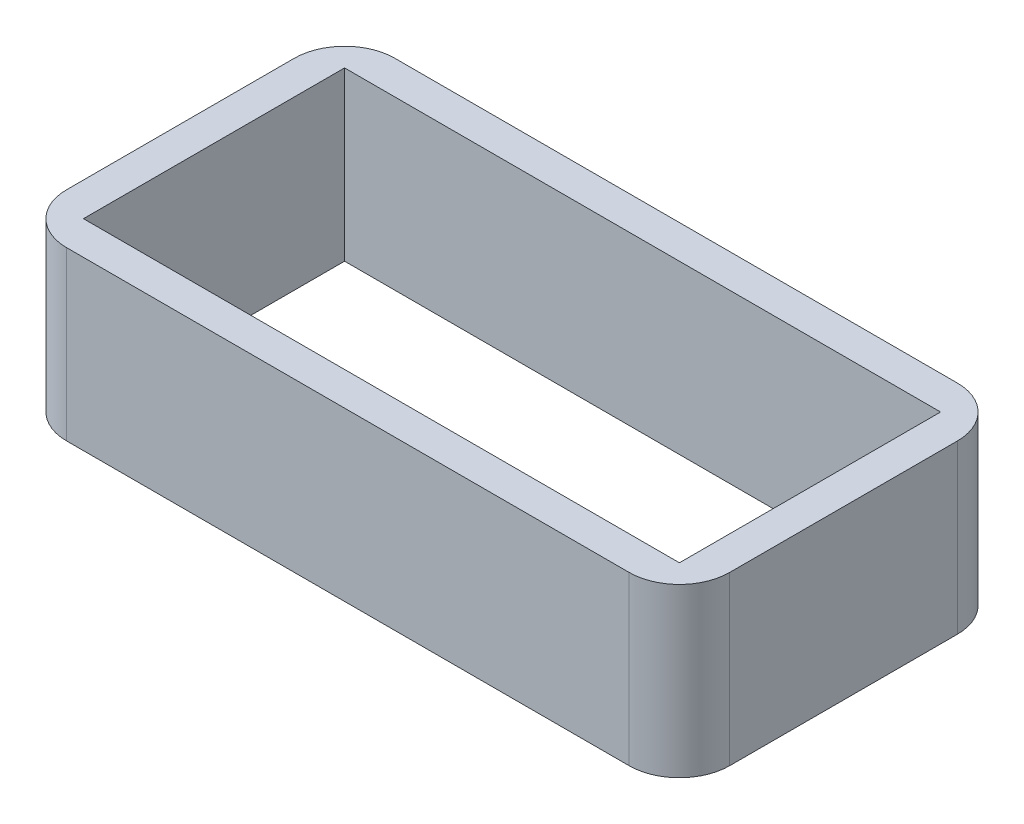
ISO-10303-21;
HEADER;
FILE_DESCRIPTION(('STEP AP214'),'2;1');
FILE_NAME('part.step','',(''),(''),'','','');
FILE_SCHEMA(('AUTOMOTIVE_DESIGN { 1 0 10303 214 1 1 1 1 }'));
ENDSEC;
DATA;
#1=APPLICATION_CONTEXT('core data for automotive mechanical design processes');
#2=APPLICATION_PROTOCOL_DEFINITION('international standard','automotive_design',2000,#1);
#3=PRODUCT_CONTEXT('',#1,'mechanical');
#4=PRODUCT('Part','Part','',(#3));
#5=PRODUCT_RELATED_PRODUCT_CATEGORY('part','',(#4));
#6=PRODUCT_DEFINITION_FORMATION('','',#4);
#7=PRODUCT_DEFINITION_CONTEXT('part definition',#1,'design');
#8=PRODUCT_DEFINITION('design','',#6,#7);
#9=PRODUCT_DEFINITION_SHAPE('','',#8);
#10=(LENGTH_UNIT() NAMED_UNIT(*) SI_UNIT(.MILLI.,.METRE.));
#11=(NAMED_UNIT(*) PLANE_ANGLE_UNIT() SI_UNIT($,.RADIAN.));
#12=(NAMED_UNIT(*) SI_UNIT($,.STERADIAN.) SOLID_ANGLE_UNIT());
#13=UNCERTAINTY_MEASURE_WITH_UNIT(LENGTH_MEASURE(1.E-05),#10,'distance_accuracy_value','');
#14=(GEOMETRIC_REPRESENTATION_CONTEXT(3) GLOBAL_UNCERTAINTY_ASSIGNED_CONTEXT((#13)) GLOBAL_UNIT_ASSIGNED_CONTEXT((#10,
#11,#12)) REPRESENTATION_CONTEXT('',''));
#15=CARTESIAN_POINT('',(0.,0.,0.));
#16=DIRECTION('',(0.,0.,1.));
#17=DIRECTION('',(1.,0.,0.));
#18=AXIS2_PLACEMENT_3D('',#15,#16,#17);
#19=CARTESIAN_POINT('',(-17.8,10.,0.));
#20=DIRECTION('',(1.,0.,0.));
#21=DIRECTION('',(0.,0.,-1.));
#22=AXIS2_PLACEMENT_3D('',#19,#20,#21);
#23=PLANE('',#22);
#24=DIRECTION('',(0.,0.,1.));
#25=VECTOR('',#24,1.);
#26=CARTESIAN_POINT('',(-17.8,0.,0.));
#27=LINE('',#26,#25);
#28=CARTESIAN_POINT('',(-17.8,0.,-7.8));
#29=VERTEX_POINT('',#28);
#30=CARTESIAN_POINT('',(-17.8,0.,7.8));
#31=VERTEX_POINT('',#30);
#32=EDGE_CURVE('E131',#29,#31,#27,.T.);
#33=ORIENTED_EDGE('',*,*,#32,.F.);
#34=DIRECTION('',(0.,-1.,0.));
#35=VECTOR('',#34,1.);
#36=CARTESIAN_POINT('',(-17.8,10.,-7.8));
#37=LINE('',#36,#35);
#38=CARTESIAN_POINT('',(-17.8,10.,-7.8));
#39=VERTEX_POINT('',#38);
#40=EDGE_CURVE('E125',#39,#29,#37,.T.);
#41=ORIENTED_EDGE('',*,*,#40,.F.);
#42=DIRECTION('',(0.,0.,1.));
#43=VECTOR('',#42,1.);
#44=CARTESIAN_POINT('',(-17.8,10.,0.));
#45=LINE('',#44,#43);
#46=CARTESIAN_POINT('',(-17.8,10.,7.8));
#47=VERTEX_POINT('',#46);
#48=EDGE_CURVE('E128',#39,#47,#45,.T.);
#49=ORIENTED_EDGE('',*,*,#48,.T.);
#50=DIRECTION('',(0.,-1.,0.));
#51=VECTOR('',#50,1.);
#52=CARTESIAN_POINT('',(-17.8,10.,7.8));
#53=LINE('',#52,#51);
#54=EDGE_CURVE('E157',#47,#31,#53,.T.);
#55=ORIENTED_EDGE('',*,*,#54,.T.);
#56=EDGE_LOOP('',(#33,#41,#49,#55));
#57=FACE_BOUND('',#56,.T.);
#58=ADVANCED_FACE('F35',(#57),#23,.T.);
#59=CARTESIAN_POINT('',(0.,10.,-7.8));
#60=DIRECTION('',(0.,0.,-1.));
#61=DIRECTION('',(-1.,0.,0.));
#62=AXIS2_PLACEMENT_3D('',#59,#60,#61);
#63=PLANE('',#62);
#64=DIRECTION('',(1.,0.,0.));
#65=VECTOR('',#64,1.);
#66=CARTESIAN_POINT('',(0.,0.,-7.8));
#67=LINE('',#66,#65);
#68=CARTESIAN_POINT('',(17.8,0.,-7.8));
#69=VERTEX_POINT('',#68);
#70=EDGE_CURVE('E171',#29,#69,#67,.T.);
#71=ORIENTED_EDGE('',*,*,#70,.T.);
#72=DIRECTION('',(0.,-1.,0.));
#73=VECTOR('',#72,1.);
#74=CARTESIAN_POINT('',(17.8,10.,-7.8));
#75=LINE('',#74,#73);
#76=CARTESIAN_POINT('',(17.8,10.,-7.8));
#77=VERTEX_POINT('',#76);
#78=EDGE_CURVE('E136',#77,#69,#75,.T.);
#79=ORIENTED_EDGE('',*,*,#78,.F.);
#80=DIRECTION('',(1.,0.,0.));
#81=VECTOR('',#80,1.);
#82=CARTESIAN_POINT('',(0.,10.,-7.8));
#83=LINE('',#82,#81);
#84=EDGE_CURVE('E140',#39,#77,#83,.T.);
#85=ORIENTED_EDGE('',*,*,#84,.F.);
#86=ORIENTED_EDGE('',*,*,#40,.T.);
#87=EDGE_LOOP('',(#71,#79,#85,#86));
#88=FACE_BOUND('',#87,.T.);
#89=ADVANCED_FACE('F141',(#88),#63,.F.);
#90=CARTESIAN_POINT('',(17.8,10.,0.));
#91=DIRECTION('',(1.,0.,0.));
#92=DIRECTION('',(0.,0.,-1.));
#93=AXIS2_PLACEMENT_3D('',#90,#91,#92);
#94=PLANE('',#93);
#95=DIRECTION('',(0.,0.,1.));
#96=VECTOR('',#95,1.);
#97=CARTESIAN_POINT('',(17.8,0.,0.));
#98=LINE('',#97,#96);
#99=CARTESIAN_POINT('',(17.8,0.,7.8));
#100=VERTEX_POINT('',#99);
#101=EDGE_CURVE('E173',#69,#100,#98,.T.);
#102=ORIENTED_EDGE('',*,*,#101,.T.);
#103=DIRECTION('',(0.,-1.,0.));
#104=VECTOR('',#103,1.);
#105=CARTESIAN_POINT('',(17.8,10.,7.8));
#106=LINE('',#105,#104);
#107=CARTESIAN_POINT('',(17.8,10.,7.8));
#108=VERTEX_POINT('',#107);
#109=EDGE_CURVE('E181',#108,#100,#106,.T.);
#110=ORIENTED_EDGE('',*,*,#109,.F.);
#111=DIRECTION('',(0.,0.,1.));
#112=VECTOR('',#111,1.);
#113=CARTESIAN_POINT('',(17.8,10.,0.));
#114=LINE('',#113,#112);
#115=EDGE_CURVE('E144',#77,#108,#114,.T.);
#116=ORIENTED_EDGE('',*,*,#115,.F.);
#117=ORIENTED_EDGE('',*,*,#78,.T.);
#118=EDGE_LOOP('',(#102,#110,#116,#117));
#119=FACE_BOUND('',#118,.T.);
#120=ADVANCED_FACE('F259',(#119),#94,.F.);
#121=CARTESIAN_POINT('',(0.,10.,-9.8));
#122=DIRECTION('',(0.,0.,-1.));
#123=DIRECTION('',(-1.,0.,0.));
#124=AXIS2_PLACEMENT_3D('',#121,#122,#123);
#125=PLANE('',#124);
#126=DIRECTION('',(1.,0.,0.));
#127=VECTOR('',#126,1.);
#128=CARTESIAN_POINT('',(0.,0.,-9.8));
#129=LINE('',#128,#127);
#130=CARTESIAN_POINT('',(-16.8,0.,-9.8));
#131=VERTEX_POINT('',#130);
#132=CARTESIAN_POINT('',(16.8,0.,-9.8));
#133=VERTEX_POINT('',#132);
#134=EDGE_CURVE('E158',#131,#133,#129,.T.);
#135=ORIENTED_EDGE('',*,*,#134,.F.);
#136=DIRECTION('',(0.,-1.,0.));
#137=VECTOR('',#136,1.);
#138=CARTESIAN_POINT('',(-16.8,10.,-9.8));
#139=LINE('',#138,#137);
#140=CARTESIAN_POINT('',(-16.8,10.,-9.8));
#141=VERTEX_POINT('',#140);
#142=EDGE_CURVE('E199',#131,#141,#139,.F.);
#143=ORIENTED_EDGE('',*,*,#142,.T.);
#144=DIRECTION('',(1.,0.,0.));
#145=VECTOR('',#144,1.);
#146=CARTESIAN_POINT('',(0.,10.,-9.8));
#147=LINE('',#146,#145);
#148=CARTESIAN_POINT('',(16.8,10.,-9.8));
#149=VERTEX_POINT('',#148);
#150=EDGE_CURVE('E179',#141,#149,#147,.T.);
#151=ORIENTED_EDGE('',*,*,#150,.T.);
#152=DIRECTION('',(0.,-1.,0.));
#153=VECTOR('',#152,1.);
#154=CARTESIAN_POINT('',(16.8,10.,-9.8));
#155=LINE('',#154,#153);
#156=EDGE_CURVE('E196',#149,#133,#155,.T.);
#157=ORIENTED_EDGE('',*,*,#156,.T.);
#158=EDGE_LOOP('',(#135,#143,#151,#157));
#159=FACE_BOUND('',#158,.T.);
#160=ADVANCED_FACE('F236',(#159),#125,.T.);
#161=CARTESIAN_POINT('',(-19.8,10.,0.));
#162=DIRECTION('',(1.,0.,0.));
#163=DIRECTION('',(0.,0.,-1.));
#164=AXIS2_PLACEMENT_3D('',#161,#162,#163);
#165=PLANE('',#164);
#166=DIRECTION('',(0.,0.,1.));
#167=VECTOR('',#166,1.);
#168=CARTESIAN_POINT('',(-19.8,10.,0.));
#169=LINE('',#168,#167);
#170=CARTESIAN_POINT('',(-19.8,10.,-6.8));
#171=VERTEX_POINT('',#170);
#172=CARTESIAN_POINT('',(-19.8,10.,6.8));
#173=VERTEX_POINT('',#172);
#174=EDGE_CURVE('E247',#171,#173,#169,.T.);
#175=ORIENTED_EDGE('',*,*,#174,.F.);
#176=DIRECTION('',(0.,-1.,0.));
#177=VECTOR('',#176,1.);
#178=CARTESIAN_POINT('',(-19.8,0.,-6.8));
#179=LINE('',#178,#177);
#180=CARTESIAN_POINT('',(-19.8,0.,-6.8));
#181=VERTEX_POINT('',#180);
#182=EDGE_CURVE('E185',#171,#181,#179,.T.);
#183=ORIENTED_EDGE('',*,*,#182,.T.);
#184=DIRECTION('',(0.,0.,1.));
#185=VECTOR('',#184,1.);
#186=CARTESIAN_POINT('',(-19.8,0.,0.));
#187=LINE('',#186,#185);
#188=CARTESIAN_POINT('',(-19.8,0.,6.8));
#189=VERTEX_POINT('',#188);
#190=EDGE_CURVE('E161',#181,#189,#187,.T.);
#191=ORIENTED_EDGE('',*,*,#190,.T.);
#192=DIRECTION('',(0.,-1.,0.));
#193=VECTOR('',#192,1.);
#194=CARTESIAN_POINT('',(-19.8,10.,6.8));
#195=LINE('',#194,#193);
#196=EDGE_CURVE('E135',#189,#173,#195,.F.);
#197=ORIENTED_EDGE('',*,*,#196,.T.);
#198=EDGE_LOOP('',(#175,#183,#191,#197));
#199=FACE_BOUND('',#198,.T.);
#200=ADVANCED_FACE('F244',(#199),#165,.F.);
#201=CARTESIAN_POINT('',(0.,10.,9.8));
#202=DIRECTION('',(0.,0.,-1.));
#203=DIRECTION('',(-1.,0.,0.));
#204=AXIS2_PLACEMENT_3D('',#201,#202,#203);
#205=PLANE('',#204);
#206=DIRECTION('',(1.,0.,0.));
#207=VECTOR('',#206,1.);
#208=CARTESIAN_POINT('',(0.,0.,9.8));
#209=LINE('',#208,#207);
#210=CARTESIAN_POINT('',(-16.8,0.,9.8));
#211=VERTEX_POINT('',#210);
#212=CARTESIAN_POINT('',(16.8,0.,9.8));
#213=VERTEX_POINT('',#212);
#214=EDGE_CURVE('E164',#211,#213,#209,.T.);
#215=ORIENTED_EDGE('',*,*,#214,.T.);
#216=DIRECTION('',(0.,-1.,0.));
#217=VECTOR('',#216,1.);
#218=CARTESIAN_POINT('',(16.8,10.,9.8));
#219=LINE('',#218,#217);
#220=CARTESIAN_POINT('',(16.8,10.,9.8));
#221=VERTEX_POINT('',#220);
#222=EDGE_CURVE('E11',#213,#221,#219,.F.);
#223=ORIENTED_EDGE('',*,*,#222,.T.);
#224=DIRECTION('',(1.,0.,0.));
#225=VECTOR('',#224,1.);
#226=CARTESIAN_POINT('',(0.,10.,9.8));
#227=LINE('',#226,#225);
#228=CARTESIAN_POINT('',(-16.8,10.,9.8));
#229=VERTEX_POINT('',#228);
#230=EDGE_CURVE('E151',#229,#221,#227,.T.);
#231=ORIENTED_EDGE('',*,*,#230,.F.);
#232=DIRECTION('',(0.,-1.,0.));
#233=VECTOR('',#232,1.);
#234=CARTESIAN_POINT('',(-16.8,10.,9.8));
#235=LINE('',#234,#233);
#236=EDGE_CURVE('E43',#229,#211,#235,.T.);
#237=ORIENTED_EDGE('',*,*,#236,.T.);
#238=EDGE_LOOP('',(#215,#223,#231,#237));
#239=FACE_BOUND('',#238,.T.);
#240=ADVANCED_FACE('F216',(#239),#205,.F.);
#241=CARTESIAN_POINT('',(19.8,10.,0.));
#242=DIRECTION('',(1.,0.,0.));
#243=DIRECTION('',(0.,0.,-1.));
#244=AXIS2_PLACEMENT_3D('',#241,#242,#243);
#245=PLANE('',#244);
#246=DIRECTION('',(0.,0.,1.));
#247=VECTOR('',#246,1.);
#248=CARTESIAN_POINT('',(19.8,0.,0.));
#249=LINE('',#248,#247);
#250=CARTESIAN_POINT('',(19.8,0.,-6.8));
#251=VERTEX_POINT('',#250);
#252=CARTESIAN_POINT('',(19.8,0.,6.8));
#253=VERTEX_POINT('',#252);
#254=EDGE_CURVE('E167',#251,#253,#249,.T.);
#255=ORIENTED_EDGE('',*,*,#254,.F.);
#256=DIRECTION('',(0.,-1.,0.));
#257=VECTOR('',#256,1.);
#258=CARTESIAN_POINT('',(19.8,10.,-6.8));
#259=LINE('',#258,#257);
#260=CARTESIAN_POINT('',(19.8,10.,-6.8));
#261=VERTEX_POINT('',#260);
#262=EDGE_CURVE('E57',#251,#261,#259,.F.);
#263=ORIENTED_EDGE('',*,*,#262,.T.);
#264=DIRECTION('',(0.,0.,1.));
#265=VECTOR('',#264,1.);
#266=CARTESIAN_POINT('',(19.8,10.,0.));
#267=LINE('',#266,#265);
#268=CARTESIAN_POINT('',(19.8,10.,6.8));
#269=VERTEX_POINT('',#268);
#270=EDGE_CURVE('E149',#261,#269,#267,.T.);
#271=ORIENTED_EDGE('',*,*,#270,.T.);
#272=DIRECTION('',(0.,-1.,0.));
#273=VECTOR('',#272,1.);
#274=CARTESIAN_POINT('',(19.8,0.,6.8));
#275=LINE('',#274,#273);
#276=EDGE_CURVE('E208',#269,#253,#275,.T.);
#277=ORIENTED_EDGE('',*,*,#276,.T.);
#278=EDGE_LOOP('',(#255,#263,#271,#277));
#279=FACE_BOUND('',#278,.T.);
#280=ADVANCED_FACE('F227',(#279),#245,.T.);
#281=CARTESIAN_POINT('',(0.,10.,7.8));
#282=DIRECTION('',(0.,0.,-1.));
#283=DIRECTION('',(-1.,0.,0.));
#284=AXIS2_PLACEMENT_3D('',#281,#282,#283);
#285=PLANE('',#284);
#286=DIRECTION('',(1.,0.,0.));
#287=VECTOR('',#286,1.);
#288=CARTESIAN_POINT('',(0.,0.,7.8));
#289=LINE('',#288,#287);
#290=EDGE_CURVE('E176',#31,#100,#289,.T.);
#291=ORIENTED_EDGE('',*,*,#290,.F.);
#292=ORIENTED_EDGE('',*,*,#54,.F.);
#293=DIRECTION('',(1.,0.,0.));
#294=VECTOR('',#293,1.);
#295=CARTESIAN_POINT('',(0.,10.,7.8));
#296=LINE('',#295,#294);
#297=EDGE_CURVE('E148',#47,#108,#296,.T.);
#298=ORIENTED_EDGE('',*,*,#297,.T.);
#299=ORIENTED_EDGE('',*,*,#109,.T.);
#300=EDGE_LOOP('',(#291,#292,#298,#299));
#301=FACE_BOUND('',#300,.T.);
#302=ADVANCED_FACE('F265',(#301),#285,.T.);
#303=CARTESIAN_POINT('',(0.,10.,0.));
#304=DIRECTION('',(0.,1.,0.));
#305=DIRECTION('',(0.,0.,1.));
#306=AXIS2_PLACEMENT_3D('',#303,#304,#305);
#307=PLANE('',#306);
#308=ORIENTED_EDGE('',*,*,#150,.F.);
#309=CARTESIAN_POINT('',(-16.8,10.,-6.8));
#310=DIRECTION('',(0.,1.,0.));
#311=DIRECTION('',(0.,0.,1.));
#312=AXIS2_PLACEMENT_3D('',#309,#310,#311);
#313=CIRCLE('',#312,3.);
#314=EDGE_CURVE('E206',#141,#171,#313,.T.);
#315=ORIENTED_EDGE('',*,*,#314,.T.);
#316=ORIENTED_EDGE('',*,*,#174,.T.);
#317=CARTESIAN_POINT('',(-16.8,10.,6.8));
#318=DIRECTION('',(0.,1.,0.));
#319=DIRECTION('',(0.,0.,1.));
#320=AXIS2_PLACEMENT_3D('',#317,#318,#319);
#321=CIRCLE('',#320,3.);
#322=EDGE_CURVE('E201',#173,#229,#321,.T.);
#323=ORIENTED_EDGE('',*,*,#322,.T.);
#324=ORIENTED_EDGE('',*,*,#230,.T.);
#325=CARTESIAN_POINT('',(16.8,10.,6.8));
#326=DIRECTION('',(0.,1.,0.));
#327=DIRECTION('',(0.,0.,1.));
#328=AXIS2_PLACEMENT_3D('',#325,#326,#327);
#329=CIRCLE('',#328,3.);
#330=EDGE_CURVE('E50',#221,#269,#329,.T.);
#331=ORIENTED_EDGE('',*,*,#330,.T.);
#332=ORIENTED_EDGE('',*,*,#270,.F.);
#333=CARTESIAN_POINT('',(16.8,10.,-6.8));
#334=DIRECTION('',(0.,1.,0.));
#335=DIRECTION('',(0.,0.,1.));
#336=AXIS2_PLACEMENT_3D('',#333,#334,#335);
#337=CIRCLE('',#336,3.);
#338=EDGE_CURVE('E204',#261,#149,#337,.T.);
#339=ORIENTED_EDGE('',*,*,#338,.T.);
#340=EDGE_LOOP('',(#308,#315,#316,#323,#324,#331,#332,#339));
#341=FACE_BOUND('',#340,.T.);
#342=ORIENTED_EDGE('',*,*,#48,.F.);
#343=ORIENTED_EDGE('',*,*,#84,.T.);
#344=ORIENTED_EDGE('',*,*,#115,.T.);
#345=ORIENTED_EDGE('',*,*,#297,.F.);
#346=EDGE_LOOP('',(#342,#343,#344,#345));
#347=FACE_BOUND('',#346,.T.);
#348=ADVANCED_FACE('F146',(#341,#347),#307,.T.);
#349=CARTESIAN_POINT('',(0.,0.,0.));
#350=DIRECTION('',(0.,1.,0.));
#351=DIRECTION('',(0.,0.,1.));
#352=AXIS2_PLACEMENT_3D('',#349,#350,#351);
#353=PLANE('',#352);
#354=ORIENTED_EDGE('',*,*,#190,.F.);
#355=CARTESIAN_POINT('',(-16.8,0.,-6.8));
#356=DIRECTION('',(0.,1.,0.));
#357=DIRECTION('',(0.,0.,1.));
#358=AXIS2_PLACEMENT_3D('',#355,#356,#357);
#359=CIRCLE('',#358,3.);
#360=EDGE_CURVE('E194',#181,#131,#359,.F.);
#361=ORIENTED_EDGE('',*,*,#360,.T.);
#362=ORIENTED_EDGE('',*,*,#134,.T.);
#363=CARTESIAN_POINT('',(16.8,0.,-6.8));
#364=DIRECTION('',(0.,1.,0.));
#365=DIRECTION('',(0.,0.,1.));
#366=AXIS2_PLACEMENT_3D('',#363,#364,#365);
#367=CIRCLE('',#366,3.);
#368=EDGE_CURVE('E192',#133,#251,#367,.F.);
#369=ORIENTED_EDGE('',*,*,#368,.T.);
#370=ORIENTED_EDGE('',*,*,#254,.T.);
#371=CARTESIAN_POINT('',(16.8,0.,6.8));
#372=DIRECTION('',(0.,1.,0.));
#373=DIRECTION('',(0.,0.,1.));
#374=AXIS2_PLACEMENT_3D('',#371,#372,#373);
#375=CIRCLE('',#374,3.);
#376=EDGE_CURVE('E190',#253,#213,#375,.F.);
#377=ORIENTED_EDGE('',*,*,#376,.T.);
#378=ORIENTED_EDGE('',*,*,#214,.F.);
#379=CARTESIAN_POINT('',(-16.8,0.,6.8));
#380=DIRECTION('',(0.,1.,0.));
#381=DIRECTION('',(0.,0.,1.));
#382=AXIS2_PLACEMENT_3D('',#379,#380,#381);
#383=CIRCLE('',#382,3.);
#384=EDGE_CURVE('E188',#211,#189,#383,.F.);
#385=ORIENTED_EDGE('',*,*,#384,.T.);
#386=EDGE_LOOP('',(#354,#361,#362,#369,#370,#377,#378,#385));
#387=FACE_BOUND('',#386,.T.);
#388=ORIENTED_EDGE('',*,*,#32,.T.);
#389=ORIENTED_EDGE('',*,*,#290,.T.);
#390=ORIENTED_EDGE('',*,*,#101,.F.);
#391=ORIENTED_EDGE('',*,*,#70,.F.);
#392=EDGE_LOOP('',(#388,#389,#390,#391));
#393=FACE_BOUND('',#392,.T.);
#394=ADVANCED_FACE('F222',(#387,#393),#353,.F.);
#395=CARTESIAN_POINT('',(-16.8,10.,-6.8));
#396=DIRECTION('',(0.,1.,0.));
#397=DIRECTION('',(0.,0.,1.));
#398=AXIS2_PLACEMENT_3D('',#395,#396,#397);
#399=CYLINDRICAL_SURFACE('',#398,3.);
#400=ORIENTED_EDGE('',*,*,#314,.F.);
#401=ORIENTED_EDGE('',*,*,#142,.F.);
#402=ORIENTED_EDGE('',*,*,#360,.F.);
#403=ORIENTED_EDGE('',*,*,#182,.F.);
#404=EDGE_LOOP('',(#400,#401,#402,#403));
#405=FACE_BOUND('',#404,.T.);
#406=ADVANCED_FACE('F241',(#405),#399,.T.);
#407=CARTESIAN_POINT('',(16.8,10.,-6.8));
#408=DIRECTION('',(0.,-1.,0.));
#409=DIRECTION('',(0.,0.,-1.));
#410=AXIS2_PLACEMENT_3D('',#407,#408,#409);
#411=CYLINDRICAL_SURFACE('',#410,3.);
#412=ORIENTED_EDGE('',*,*,#338,.F.);
#413=ORIENTED_EDGE('',*,*,#262,.F.);
#414=ORIENTED_EDGE('',*,*,#368,.F.);
#415=ORIENTED_EDGE('',*,*,#156,.F.);
#416=EDGE_LOOP('',(#412,#413,#414,#415));
#417=FACE_BOUND('',#416,.T.);
#418=ADVANCED_FACE('F233',(#417),#411,.T.);
#419=CARTESIAN_POINT('',(16.8,10.,6.8));
#420=DIRECTION('',(0.,1.,0.));
#421=DIRECTION('',(0.,0.,1.));
#422=AXIS2_PLACEMENT_3D('',#419,#420,#421);
#423=CYLINDRICAL_SURFACE('',#422,3.);
#424=ORIENTED_EDGE('',*,*,#330,.F.);
#425=ORIENTED_EDGE('',*,*,#222,.F.);
#426=ORIENTED_EDGE('',*,*,#376,.F.);
#427=ORIENTED_EDGE('',*,*,#276,.F.);
#428=EDGE_LOOP('',(#424,#425,#426,#427));
#429=FACE_BOUND('',#428,.T.);
#430=ADVANCED_FACE('F226',(#429),#423,.T.);
#431=CARTESIAN_POINT('',(-16.8,10.,6.8));
#432=DIRECTION('',(0.,-1.,0.));
#433=DIRECTION('',(0.,0.,-1.));
#434=AXIS2_PLACEMENT_3D('',#431,#432,#433);
#435=CYLINDRICAL_SURFACE('',#434,3.);
#436=ORIENTED_EDGE('',*,*,#322,.F.);
#437=ORIENTED_EDGE('',*,*,#196,.F.);
#438=ORIENTED_EDGE('',*,*,#384,.F.);
#439=ORIENTED_EDGE('',*,*,#236,.F.);
#440=EDGE_LOOP('',(#436,#437,#438,#439));
#441=FACE_BOUND('',#440,.T.);
#442=ADVANCED_FACE('F37',(#441),#435,.T.);
#443=CLOSED_SHELL('',(#58,#89,#120,#160,#200,#240,#280,#302,#348,#394,#406,#418,#430,#442));
#444=MANIFOLD_SOLID_BREP('B2',#443);
#445=ADVANCED_BREP_SHAPE_REPRESENTATION('',(#18,#444),#14);
#446=SHAPE_DEFINITION_REPRESENTATION(#9,#445);
ENDSEC;
END-ISO-10303-21;
